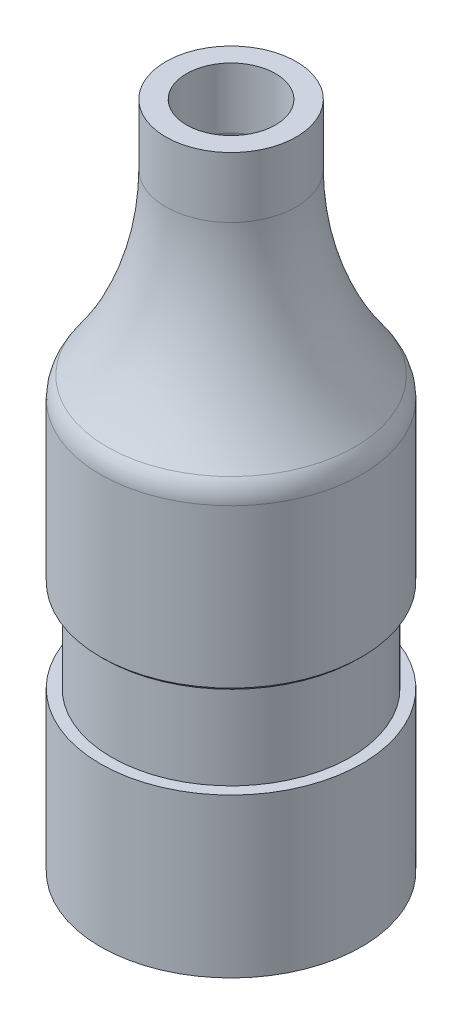
ISO-10303-21;
HEADER;
FILE_DESCRIPTION(('STEP AP214'),'2;1');
FILE_NAME('part.step','',(''),(''),'','','');
FILE_SCHEMA(('AUTOMOTIVE_DESIGN { 1 0 10303 214 1 1 1 1 }'));
ENDSEC;
DATA;
#1=APPLICATION_CONTEXT('core data for automotive mechanical design processes');
#2=APPLICATION_PROTOCOL_DEFINITION('international standard','automotive_design',2000,#1);
#3=PRODUCT_CONTEXT('',#1,'mechanical');
#4=PRODUCT('Part','Part','',(#3));
#5=PRODUCT_RELATED_PRODUCT_CATEGORY('part','',(#4));
#6=PRODUCT_DEFINITION_FORMATION('','',#4);
#7=PRODUCT_DEFINITION_CONTEXT('part definition',#1,'design');
#8=PRODUCT_DEFINITION('design','',#6,#7);
#9=PRODUCT_DEFINITION_SHAPE('','',#8);
#10=(LENGTH_UNIT() NAMED_UNIT(*) SI_UNIT(.MILLI.,.METRE.));
#11=(NAMED_UNIT(*) PLANE_ANGLE_UNIT() SI_UNIT($,.RADIAN.));
#12=(NAMED_UNIT(*) SI_UNIT($,.STERADIAN.) SOLID_ANGLE_UNIT());
#13=UNCERTAINTY_MEASURE_WITH_UNIT(LENGTH_MEASURE(1.E-05),#10,'distance_accuracy_value','');
#14=(GEOMETRIC_REPRESENTATION_CONTEXT(3) GLOBAL_UNCERTAINTY_ASSIGNED_CONTEXT((#13)) GLOBAL_UNIT_ASSIGNED_CONTEXT((#10,
#11,#12)) REPRESENTATION_CONTEXT('',''));
#15=CARTESIAN_POINT('',(0.,0.,0.));
#16=DIRECTION('',(0.,0.,1.));
#17=DIRECTION('',(1.,0.,0.));
#18=AXIS2_PLACEMENT_3D('',#15,#16,#17);
#19=CARTESIAN_POINT('',(0.,43.62,0.));
#20=DIRECTION('',(0.,1.,0.));
#21=DIRECTION('',(0.,0.,1.));
#22=AXIS2_PLACEMENT_3D('',#19,#20,#21);
#23=CYLINDRICAL_SURFACE('',#22,7.55000000000001);
#24=CARTESIAN_POINT('',(0.,28.6225046205706,0.));
#25=DIRECTION('',(0.,1.,0.));
#26=DIRECTION('',(0.,0.,1.));
#27=AXIS2_PLACEMENT_3D('',#24,#25,#26);
#28=CIRCLE('',#27,7.55000000000001);
#29=CARTESIAN_POINT('',(0.,28.6225046205706,7.55000000000001));
#30=VERTEX_POINT('',#29);
#31=EDGE_CURVE('E10',#30,#30,#28,.T.);
#32=ORIENTED_EDGE('',*,*,#31,.F.);
#33=EDGE_LOOP('',(#32));
#34=FACE_BOUND('',#33,.T.);
#35=CARTESIAN_POINT('',(0.,19.5,0.));
#36=DIRECTION('',(0.,1.,0.));
#37=DIRECTION('',(0.,0.,1.));
#38=AXIS2_PLACEMENT_3D('',#35,#36,#37);
#39=CIRCLE('',#38,7.55000000000001);
#40=CARTESIAN_POINT('',(0.,19.5,7.55000000000001));
#41=VERTEX_POINT('',#40);
#42=EDGE_CURVE('E90',#41,#41,#39,.T.);
#43=ORIENTED_EDGE('',*,*,#42,.T.);
#44=EDGE_LOOP('',(#43));
#45=FACE_BOUND('',#44,.T.);
#46=ADVANCED_FACE('F32',(#34,#45),#23,.T.);
#47=CARTESIAN_POINT('',(0.,28.6225046205706,0.));
#48=DIRECTION('',(0.,1.,0.));
#49=DIRECTION('',(0.,0.,1.));
#50=AXIS2_PLACEMENT_3D('',#47,#48,#49);
#51=TOROIDAL_SURFACE('',#50,5.55,2.);
#52=CARTESIAN_POINT('',(0.,29.8092958596748,0.));
#53=DIRECTION('',(0.,1.,0.));
#54=DIRECTION('',(0.,0.,1.));
#55=AXIS2_PLACEMENT_3D('',#52,#53,#54);
#56=CIRCLE('',#55,7.15982190157345);
#57=CARTESIAN_POINT('',(0.,29.8092958596748,7.15982190157345));
#58=VERTEX_POINT('',#57);
#59=EDGE_CURVE('E38',#58,#58,#56,.T.);
#60=ORIENTED_EDGE('',*,*,#59,.F.);
#61=EDGE_LOOP('',(#60));
#62=FACE_BOUND('',#61,.T.);
#63=ORIENTED_EDGE('',*,*,#31,.T.);
#64=EDGE_LOOP('',(#63));
#65=FACE_BOUND('',#64,.T.);
#66=ADVANCED_FACE('F143',(#62,#65),#51,.T.);
#67=CARTESIAN_POINT('',(0.,40.12,0.));
#68=DIRECTION('',(0.,1.,0.));
#69=DIRECTION('',(0.,0.,1.));
#70=AXIS2_PLACEMENT_3D('',#67,#68,#69);
#71=TOROIDAL_SURFACE('',#70,21.1457671957671,17.3757671957671);
#72=ORIENTED_EDGE('',*,*,#59,.T.);
#73=EDGE_LOOP('',(#72));
#74=FACE_BOUND('',#73,.T.);
#75=CARTESIAN_POINT('',(0.,40.12,0.));
#76=DIRECTION('',(0.,1.,0.));
#77=DIRECTION('',(0.,0.,1.));
#78=AXIS2_PLACEMENT_3D('',#75,#76,#77);
#79=CIRCLE('',#78,3.77);
#80=CARTESIAN_POINT('',(0.,40.12,3.77));
#81=VERTEX_POINT('',#80);
#82=EDGE_CURVE('E42',#81,#81,#79,.T.);
#83=ORIENTED_EDGE('',*,*,#82,.F.);
#84=EDGE_LOOP('',(#83));
#85=FACE_BOUND('',#84,.T.);
#86=ADVANCED_FACE('F148',(#74,#85),#71,.F.);
#87=CARTESIAN_POINT('',(0.,43.62,0.));
#88=DIRECTION('',(0.,1.,0.));
#89=DIRECTION('',(0.,0.,1.));
#90=AXIS2_PLACEMENT_3D('',#87,#88,#89);
#91=CYLINDRICAL_SURFACE('',#90,3.77);
#92=ORIENTED_EDGE('',*,*,#82,.T.);
#93=EDGE_LOOP('',(#92));
#94=FACE_BOUND('',#93,.T.);
#95=CARTESIAN_POINT('',(0.,43.62,0.));
#96=DIRECTION('',(0.,1.,0.));
#97=DIRECTION('',(0.,0.,1.));
#98=AXIS2_PLACEMENT_3D('',#95,#96,#97);
#99=CIRCLE('',#98,3.77);
#100=CARTESIAN_POINT('',(0.,43.62,3.77));
#101=VERTEX_POINT('',#100);
#102=EDGE_CURVE('E46',#101,#101,#99,.T.);
#103=ORIENTED_EDGE('',*,*,#102,.F.);
#104=EDGE_LOOP('',(#103));
#105=FACE_BOUND('',#104,.T.);
#106=ADVANCED_FACE('F153',(#94,#105),#91,.T.);
#107=CARTESIAN_POINT('',(0.,43.62,0.));
#108=DIRECTION('',(0.,-1.,0.));
#109=DIRECTION('',(0.,0.,-1.));
#110=AXIS2_PLACEMENT_3D('',#107,#108,#109);
#111=PLANE('',#110);
#112=CARTESIAN_POINT('',(0.,43.62,0.));
#113=DIRECTION('',(0.,1.,0.));
#114=DIRECTION('',(0.,0.,1.));
#115=AXIS2_PLACEMENT_3D('',#112,#113,#114);
#116=CIRCLE('',#115,2.57);
#117=CARTESIAN_POINT('',(0.,43.62,2.57));
#118=VERTEX_POINT('',#117);
#119=EDGE_CURVE('E51',#118,#118,#116,.T.);
#120=ORIENTED_EDGE('',*,*,#119,.F.);
#121=EDGE_LOOP('',(#120));
#122=FACE_BOUND('',#121,.T.);
#123=ORIENTED_EDGE('',*,*,#102,.T.);
#124=EDGE_LOOP('',(#123));
#125=FACE_BOUND('',#124,.T.);
#126=ADVANCED_FACE('F158',(#122,#125),#111,.F.);
#127=CARTESIAN_POINT('',(0.,43.62,0.));
#128=DIRECTION('',(0.,1.,0.));
#129=DIRECTION('',(0.,0.,1.));
#130=AXIS2_PLACEMENT_3D('',#127,#128,#129);
#131=CYLINDRICAL_SURFACE('',#130,2.57);
#132=CARTESIAN_POINT('',(0.,40.12,0.));
#133=DIRECTION('',(0.,1.,0.));
#134=DIRECTION('',(0.,0.,1.));
#135=AXIS2_PLACEMENT_3D('',#132,#133,#134);
#136=CIRCLE('',#135,2.57);
#137=CARTESIAN_POINT('',(0.,40.12,2.57));
#138=VERTEX_POINT('',#137);
#139=EDGE_CURVE('E54',#138,#138,#136,.T.);
#140=ORIENTED_EDGE('',*,*,#139,.F.);
#141=EDGE_LOOP('',(#140));
#142=FACE_BOUND('',#141,.T.);
#143=ORIENTED_EDGE('',*,*,#119,.T.);
#144=EDGE_LOOP('',(#143));
#145=FACE_BOUND('',#144,.T.);
#146=ADVANCED_FACE('F162',(#142,#145),#131,.F.);
#147=CARTESIAN_POINT('',(0.,40.12,0.));
#148=DIRECTION('',(0.,-1.,0.));
#149=DIRECTION('',(0.,0.,-1.));
#150=AXIS2_PLACEMENT_3D('',#147,#148,#149);
#151=CONICAL_SURFACE('',#150,2.57,0.198817023000529);
#152=CARTESIAN_POINT('',(0.,29.3,0.));
#153=DIRECTION('',(0.,1.,0.));
#154=DIRECTION('',(0.,0.,1.));
#155=AXIS2_PLACEMENT_3D('',#152,#153,#154);
#156=CIRCLE('',#155,4.75);
#157=CARTESIAN_POINT('',(0.,29.3,4.75));
#158=VERTEX_POINT('',#157);
#159=EDGE_CURVE('E57',#158,#158,#156,.T.);
#160=ORIENTED_EDGE('',*,*,#159,.F.);
#161=EDGE_LOOP('',(#160));
#162=FACE_BOUND('',#161,.T.);
#163=ORIENTED_EDGE('',*,*,#139,.T.);
#164=EDGE_LOOP('',(#163));
#165=FACE_BOUND('',#164,.T.);
#166=ADVANCED_FACE('F166',(#162,#165),#151,.F.);
#167=CARTESIAN_POINT('',(0.,43.62,0.));
#168=DIRECTION('',(0.,1.,0.));
#169=DIRECTION('',(0.,0.,1.));
#170=AXIS2_PLACEMENT_3D('',#167,#168,#169);
#171=CYLINDRICAL_SURFACE('',#170,4.75);
#172=ORIENTED_EDGE('',*,*,#159,.T.);
#173=EDGE_LOOP('',(#172));
#174=FACE_BOUND('',#173,.T.);
#175=CARTESIAN_POINT('',(0.,20.5,0.));
#176=DIRECTION('',(0.,1.,0.));
#177=DIRECTION('',(0.,0.,1.));
#178=AXIS2_PLACEMENT_3D('',#175,#176,#177);
#179=CIRCLE('',#178,4.75);
#180=CARTESIAN_POINT('',(0.,20.5,4.75));
#181=VERTEX_POINT('',#180);
#182=EDGE_CURVE('E60',#181,#181,#179,.T.);
#183=ORIENTED_EDGE('',*,*,#182,.F.);
#184=EDGE_LOOP('',(#183));
#185=FACE_BOUND('',#184,.T.);
#186=ADVANCED_FACE('F170',(#174,#185),#171,.F.);
#187=CARTESIAN_POINT('',(-3.55618312575242E-13,20.5,0.));
#188=DIRECTION('',(0.,-1.,0.));
#189=DIRECTION('',(0.,0.,-1.));
#190=AXIS2_PLACEMENT_3D('',#187,#188,#189);
#191=PLANE('',#190);
#192=ORIENTED_EDGE('',*,*,#182,.T.);
#193=EDGE_LOOP('',(#192));
#194=FACE_BOUND('',#193,.T.);
#195=CARTESIAN_POINT('',(0.,20.5,0.));
#196=DIRECTION('',(0.,1.,0.));
#197=DIRECTION('',(0.,0.,1.));
#198=AXIS2_PLACEMENT_3D('',#195,#196,#197);
#199=CIRCLE('',#198,4.95);
#200=CARTESIAN_POINT('',(0.,20.5,4.95));
#201=VERTEX_POINT('',#200);
#202=EDGE_CURVE('E63',#201,#201,#199,.T.);
#203=ORIENTED_EDGE('',*,*,#202,.F.);
#204=EDGE_LOOP('',(#203));
#205=FACE_BOUND('',#204,.T.);
#206=ADVANCED_FACE('F174',(#194,#205),#191,.T.);
#207=CARTESIAN_POINT('',(0.,43.62,0.));
#208=DIRECTION('',(0.,1.,0.));
#209=DIRECTION('',(0.,0.,1.));
#210=AXIS2_PLACEMENT_3D('',#207,#208,#209);
#211=CYLINDRICAL_SURFACE('',#210,4.95);
#212=ORIENTED_EDGE('',*,*,#202,.T.);
#213=EDGE_LOOP('',(#212));
#214=FACE_BOUND('',#213,.T.);
#215=CARTESIAN_POINT('',(0.,12.95,0.));
#216=DIRECTION('',(0.,1.,0.));
#217=DIRECTION('',(0.,0.,1.));
#218=AXIS2_PLACEMENT_3D('',#215,#216,#217);
#219=CIRCLE('',#218,4.95);
#220=CARTESIAN_POINT('',(0.,12.95,4.95));
#221=VERTEX_POINT('',#220);
#222=EDGE_CURVE('E66',#221,#221,#219,.T.);
#223=ORIENTED_EDGE('',*,*,#222,.F.);
#224=EDGE_LOOP('',(#223));
#225=FACE_BOUND('',#224,.T.);
#226=ADVANCED_FACE('F139',(#214,#225),#211,.F.);
#227=CARTESIAN_POINT('',(0.,12.95,0.));
#228=DIRECTION('',(0.,-1.,0.));
#229=DIRECTION('',(0.,0.,-1.));
#230=AXIS2_PLACEMENT_3D('',#227,#228,#229);
#231=PLANE('',#230);
#232=ORIENTED_EDGE('',*,*,#222,.T.);
#233=EDGE_LOOP('',(#232));
#234=FACE_BOUND('',#233,.T.);
#235=CARTESIAN_POINT('',(0.,12.95,0.));
#236=DIRECTION('',(0.,1.,0.));
#237=DIRECTION('',(0.,0.,1.));
#238=AXIS2_PLACEMENT_3D('',#235,#236,#237);
#239=CIRCLE('',#238,6.35);
#240=CARTESIAN_POINT('',(0.,12.95,6.35));
#241=VERTEX_POINT('',#240);
#242=EDGE_CURVE('E69',#241,#241,#239,.T.);
#243=ORIENTED_EDGE('',*,*,#242,.F.);
#244=EDGE_LOOP('',(#243));
#245=FACE_BOUND('',#244,.T.);
#246=ADVANCED_FACE('F133',(#234,#245),#231,.T.);
#247=CARTESIAN_POINT('',(0.,43.62,0.));
#248=DIRECTION('',(0.,1.,0.));
#249=DIRECTION('',(0.,0.,1.));
#250=AXIS2_PLACEMENT_3D('',#247,#248,#249);
#251=CYLINDRICAL_SURFACE('',#250,6.35);
#252=ORIENTED_EDGE('',*,*,#242,.T.);
#253=EDGE_LOOP('',(#252));
#254=FACE_BOUND('',#253,.T.);
#255=CARTESIAN_POINT('',(0.,5.,0.));
#256=DIRECTION('',(0.,1.,0.));
#257=DIRECTION('',(0.,0.,1.));
#258=AXIS2_PLACEMENT_3D('',#255,#256,#257);
#259=CIRCLE('',#258,6.35);
#260=CARTESIAN_POINT('',(0.,5.,6.35));
#261=VERTEX_POINT('',#260);
#262=EDGE_CURVE('E72',#261,#261,#259,.T.);
#263=ORIENTED_EDGE('',*,*,#262,.F.);
#264=EDGE_LOOP('',(#263));
#265=FACE_BOUND('',#264,.T.);
#266=ADVANCED_FACE('F128',(#254,#265),#251,.F.);
#267=CARTESIAN_POINT('',(0.,5.,0.));
#268=DIRECTION('',(0.,1.,0.));
#269=DIRECTION('',(0.,0.,1.));
#270=AXIS2_PLACEMENT_3D('',#267,#268,#269);
#271=PLANE('',#270);
#272=CARTESIAN_POINT('',(0.,5.,0.));
#273=DIRECTION('',(0.,1.,0.));
#274=DIRECTION('',(0.,0.,1.));
#275=AXIS2_PLACEMENT_3D('',#272,#273,#274);
#276=CIRCLE('',#275,7.55000000000001);
#277=CARTESIAN_POINT('',(0.,5.,7.55000000000001));
#278=VERTEX_POINT('',#277);
#279=EDGE_CURVE('E75',#278,#278,#276,.T.);
#280=ORIENTED_EDGE('',*,*,#279,.F.);
#281=EDGE_LOOP('',(#280));
#282=FACE_BOUND('',#281,.T.);
#283=ORIENTED_EDGE('',*,*,#262,.T.);
#284=EDGE_LOOP('',(#283));
#285=FACE_BOUND('',#284,.T.);
#286=ADVANCED_FACE('F122',(#282,#285),#271,.F.);
#287=CARTESIAN_POINT('',(0.,43.62,0.));
#288=DIRECTION('',(0.,1.,0.));
#289=DIRECTION('',(0.,0.,1.));
#290=AXIS2_PLACEMENT_3D('',#287,#288,#289);
#291=CYLINDRICAL_SURFACE('',#290,7.55000000000001);
#292=CARTESIAN_POINT('',(0.,14.15,0.));
#293=DIRECTION('',(0.,1.,0.));
#294=DIRECTION('',(0.,0.,1.));
#295=AXIS2_PLACEMENT_3D('',#292,#293,#294);
#296=CIRCLE('',#295,7.55000000000001);
#297=CARTESIAN_POINT('',(0.,14.15,7.55000000000001));
#298=VERTEX_POINT('',#297);
#299=EDGE_CURVE('E78',#298,#298,#296,.T.);
#300=ORIENTED_EDGE('',*,*,#299,.F.);
#301=EDGE_LOOP('',(#300));
#302=FACE_BOUND('',#301,.T.);
#303=ORIENTED_EDGE('',*,*,#279,.T.);
#304=EDGE_LOOP('',(#303));
#305=FACE_BOUND('',#304,.T.);
#306=ADVANCED_FACE('F116',(#302,#305),#291,.T.);
#307=CARTESIAN_POINT('',(0.,14.15,0.));
#308=DIRECTION('',(0.,-1.,0.));
#309=DIRECTION('',(0.,0.,-1.));
#310=AXIS2_PLACEMENT_3D('',#307,#308,#309);
#311=PLANE('',#310);
#312=CARTESIAN_POINT('',(0.,14.15,0.));
#313=DIRECTION('',(0.,1.,0.));
#314=DIRECTION('',(0.,0.,1.));
#315=AXIS2_PLACEMENT_3D('',#312,#313,#314);
#316=CIRCLE('',#315,6.90000000000001);
#317=CARTESIAN_POINT('',(0.,14.15,6.90000000000001));
#318=VERTEX_POINT('',#317);
#319=EDGE_CURVE('E81',#318,#318,#316,.T.);
#320=ORIENTED_EDGE('',*,*,#319,.F.);
#321=EDGE_LOOP('',(#320));
#322=FACE_BOUND('',#321,.T.);
#323=ORIENTED_EDGE('',*,*,#299,.T.);
#324=EDGE_LOOP('',(#323));
#325=FACE_BOUND('',#324,.T.);
#326=ADVANCED_FACE('F110',(#322,#325),#311,.F.);
#327=CARTESIAN_POINT('',(0.,43.62,0.));
#328=DIRECTION('',(0.,1.,0.));
#329=DIRECTION('',(0.,0.,1.));
#330=AXIS2_PLACEMENT_3D('',#327,#328,#329);
#331=CYLINDRICAL_SURFACE('',#330,6.90000000000001);
#332=CARTESIAN_POINT('',(0.,19.3,0.));
#333=DIRECTION('',(0.,1.,0.));
#334=DIRECTION('',(0.,0.,1.));
#335=AXIS2_PLACEMENT_3D('',#332,#333,#334);
#336=CIRCLE('',#335,6.90000000000001);
#337=CARTESIAN_POINT('',(0.,19.3,6.90000000000001));
#338=VERTEX_POINT('',#337);
#339=EDGE_CURVE('E84',#338,#338,#336,.T.);
#340=ORIENTED_EDGE('',*,*,#339,.F.);
#341=EDGE_LOOP('',(#340));
#342=FACE_BOUND('',#341,.T.);
#343=ORIENTED_EDGE('',*,*,#319,.T.);
#344=EDGE_LOOP('',(#343));
#345=FACE_BOUND('',#344,.T.);
#346=ADVANCED_FACE('F104',(#342,#345),#331,.T.);
#347=CARTESIAN_POINT('',(0.,19.3,0.));
#348=DIRECTION('',(0.,1.,0.));
#349=DIRECTION('',(0.,0.,1.));
#350=AXIS2_PLACEMENT_3D('',#347,#348,#349);
#351=PLANE('',#350);
#352=CARTESIAN_POINT('',(0.,19.3,0.));
#353=DIRECTION('',(0.,1.,0.));
#354=DIRECTION('',(0.,0.,1.));
#355=AXIS2_PLACEMENT_3D('',#352,#353,#354);
#356=CIRCLE('',#355,7.35000000000001);
#357=CARTESIAN_POINT('',(0.,19.3,7.35000000000001));
#358=VERTEX_POINT('',#357);
#359=EDGE_CURVE('E87',#358,#358,#356,.T.);
#360=ORIENTED_EDGE('',*,*,#359,.F.);
#361=EDGE_LOOP('',(#360));
#362=FACE_BOUND('',#361,.T.);
#363=ORIENTED_EDGE('',*,*,#339,.T.);
#364=EDGE_LOOP('',(#363));
#365=FACE_BOUND('',#364,.T.);
#366=ADVANCED_FACE('F98',(#362,#365),#351,.F.);
#367=CARTESIAN_POINT('',(0.,19.3,0.));
#368=DIRECTION('',(0.,1.,0.));
#369=DIRECTION('',(0.,0.,1.));
#370=AXIS2_PLACEMENT_3D('',#367,#368,#369);
#371=CONICAL_SURFACE('',#370,7.35000000000001,0.78539816339745);
#372=ORIENTED_EDGE('',*,*,#42,.F.);
#373=EDGE_LOOP('',(#372));
#374=FACE_BOUND('',#373,.T.);
#375=ORIENTED_EDGE('',*,*,#359,.T.);
#376=EDGE_LOOP('',(#375));
#377=FACE_BOUND('',#376,.T.);
#378=ADVANCED_FACE('F95',(#374,#377),#371,.T.);
#379=CLOSED_SHELL('',(#46,#66,#86,#106,#126,#146,#166,#186,#206,#226,#246,#266,#286,#306,#326,
#346,#366,#378));
#380=MANIFOLD_SOLID_BREP('B2',#379);
#381=ADVANCED_BREP_SHAPE_REPRESENTATION('',(#18,#380),#14);
#382=SHAPE_DEFINITION_REPRESENTATION(#9,#381);
ENDSEC;
END-ISO-10303-21;
